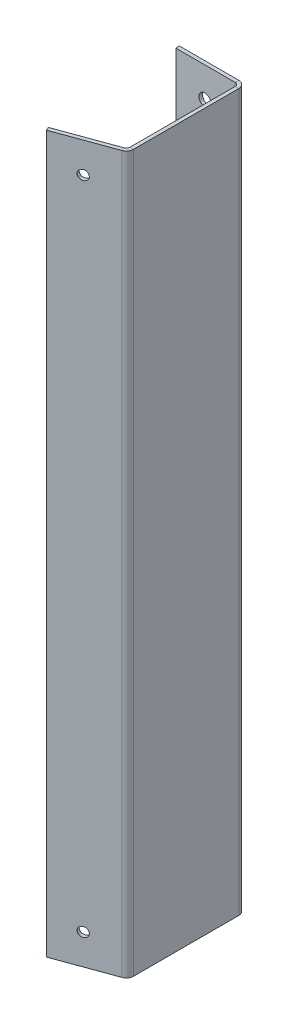
ISO-10303-21;
HEADER;
FILE_DESCRIPTION(('STEP AP214'),'2;1');
FILE_NAME('part.step','',(''),(''),'','','');
FILE_SCHEMA(('AUTOMOTIVE_DESIGN { 1 0 10303 214 1 1 1 1 }'));
ENDSEC;
DATA;
#1=APPLICATION_CONTEXT('core data for automotive mechanical design processes');
#2=APPLICATION_PROTOCOL_DEFINITION('international standard','automotive_design',2000,#1);
#3=PRODUCT_CONTEXT('',#1,'mechanical');
#4=PRODUCT('Part','Part','',(#3));
#5=PRODUCT_RELATED_PRODUCT_CATEGORY('part','',(#4));
#6=PRODUCT_DEFINITION_FORMATION('','',#4);
#7=PRODUCT_DEFINITION_CONTEXT('part definition',#1,'design');
#8=PRODUCT_DEFINITION('design','',#6,#7);
#9=PRODUCT_DEFINITION_SHAPE('','',#8);
#10=(LENGTH_UNIT() NAMED_UNIT(*) SI_UNIT(.MILLI.,.METRE.));
#11=(NAMED_UNIT(*) PLANE_ANGLE_UNIT() SI_UNIT($,.RADIAN.));
#12=(NAMED_UNIT(*) SI_UNIT($,.STERADIAN.) SOLID_ANGLE_UNIT());
#13=UNCERTAINTY_MEASURE_WITH_UNIT(LENGTH_MEASURE(1.E-05),#10,'distance_accuracy_value','');
#14=(GEOMETRIC_REPRESENTATION_CONTEXT(3) GLOBAL_UNCERTAINTY_ASSIGNED_CONTEXT((#13)) GLOBAL_UNIT_ASSIGNED_CONTEXT((#10,
#11,#12)) REPRESENTATION_CONTEXT('',''));
#15=CARTESIAN_POINT('',(0.,0.,0.));
#16=DIRECTION('',(0.,0.,1.));
#17=DIRECTION('',(1.,0.,0.));
#18=AXIS2_PLACEMENT_3D('',#15,#16,#17);
#19=CARTESIAN_POINT('',(-1.5,150.,-50.));
#20=DIRECTION('',(0.,1.,0.));
#21=DIRECTION('',(0.,0.,1.));
#22=AXIS2_PLACEMENT_3D('',#19,#20,#21);
#23=PLANE('',#22);
#24=DIRECTION('',(0.,0.,1.));
#25=VECTOR('',#24,1.);
#26=CARTESIAN_POINT('',(-1.5,150.,-50.));
#27=LINE('',#26,#25);
#28=CARTESIAN_POINT('',(-1.5,150.,-21.6));
#29=VERTEX_POINT('',#28);
#30=CARTESIAN_POINT('',(-1.5,150.,22.4993773853709));
#31=VERTEX_POINT('',#30);
#32=EDGE_CURVE('E330',#29,#31,#27,.T.);
#33=ORIENTED_EDGE('',*,*,#32,.T.);
#34=DIRECTION('',(1.,0.,0.));
#35=VECTOR('',#34,1.);
#36=CARTESIAN_POINT('',(-1.5,150.,22.4993773853709));
#37=LINE('',#36,#35);
#38=CARTESIAN_POINT('',(0.,150.,22.4993773853709));
#39=VERTEX_POINT('',#38);
#40=EDGE_CURVE('E12',#31,#39,#37,.T.);
#41=ORIENTED_EDGE('',*,*,#40,.T.);
#42=DIRECTION('',(0.,0.,1.));
#43=VECTOR('',#42,1.);
#44=CARTESIAN_POINT('',(0.,150.,-50.));
#45=LINE('',#44,#43);
#46=CARTESIAN_POINT('',(0.,150.,-21.6));
#47=VERTEX_POINT('',#46);
#48=EDGE_CURVE('E274',#47,#39,#45,.T.);
#49=ORIENTED_EDGE('',*,*,#48,.F.);
#50=DIRECTION('',(1.,0.,0.));
#51=VECTOR('',#50,1.);
#52=CARTESIAN_POINT('',(-1.5,150.,-21.6));
#53=LINE('',#52,#51);
#54=EDGE_CURVE('E279',#29,#47,#53,.T.);
#55=ORIENTED_EDGE('',*,*,#54,.F.);
#56=EDGE_LOOP('',(#33,#41,#49,#55));
#57=FACE_BOUND('',#56,.T.);
#58=ADVANCED_FACE('F102',(#57),#23,.T.);
#59=CARTESIAN_POINT('',(-1.5,-150.,-50.));
#60=DIRECTION('',(0.,-1.,0.));
#61=DIRECTION('',(0.,0.,-1.));
#62=AXIS2_PLACEMENT_3D('',#59,#60,#61);
#63=PLANE('',#62);
#64=DIRECTION('',(0.,0.,-1.));
#65=VECTOR('',#64,1.);
#66=CARTESIAN_POINT('',(0.,-150.,-50.));
#67=LINE('',#66,#65);
#68=CARTESIAN_POINT('',(0.,-150.,22.4993773853709));
#69=VERTEX_POINT('',#68);
#70=CARTESIAN_POINT('',(0.,-150.,-21.6));
#71=VERTEX_POINT('',#70);
#72=EDGE_CURVE('E273',#69,#71,#67,.T.);
#73=ORIENTED_EDGE('',*,*,#72,.F.);
#74=DIRECTION('',(-1.,0.,0.));
#75=VECTOR('',#74,1.);
#76=CARTESIAN_POINT('',(-1.5,-150.,22.4993773853709));
#77=LINE('',#76,#75);
#78=CARTESIAN_POINT('',(-1.5,-150.,22.4993773853709));
#79=VERTEX_POINT('',#78);
#80=EDGE_CURVE('E331',#69,#79,#77,.T.);
#81=ORIENTED_EDGE('',*,*,#80,.T.);
#82=DIRECTION('',(0.,0.,-1.));
#83=VECTOR('',#82,1.);
#84=CARTESIAN_POINT('',(-1.5,-150.,-50.));
#85=LINE('',#84,#83);
#86=CARTESIAN_POINT('',(-1.5,-150.,-21.6));
#87=VERTEX_POINT('',#86);
#88=EDGE_CURVE('E108',#79,#87,#85,.T.);
#89=ORIENTED_EDGE('',*,*,#88,.T.);
#90=DIRECTION('',(-1.,0.,0.));
#91=VECTOR('',#90,1.);
#92=CARTESIAN_POINT('',(-1.5,-150.,-21.6));
#93=LINE('',#92,#91);
#94=EDGE_CURVE('E276',#71,#87,#93,.T.);
#95=ORIENTED_EDGE('',*,*,#94,.F.);
#96=EDGE_LOOP('',(#73,#81,#89,#95));
#97=FACE_BOUND('',#96,.T.);
#98=ADVANCED_FACE('F358',(#97),#63,.T.);
#99=CARTESIAN_POINT('',(-1.5,0.,0.));
#100=DIRECTION('',(-1.,0.,0.));
#101=DIRECTION('',(0.,0.,1.));
#102=AXIS2_PLACEMENT_3D('',#99,#100,#101);
#103=PLANE('',#102);
#104=ORIENTED_EDGE('',*,*,#88,.F.);
#105=DIRECTION('',(0.,1.,0.));
#106=VECTOR('',#105,1.);
#107=CARTESIAN_POINT('',(-1.5,0.,22.4993773853709));
#108=LINE('',#107,#106);
#109=EDGE_CURVE('E316',#79,#31,#108,.T.);
#110=ORIENTED_EDGE('',*,*,#109,.T.);
#111=ORIENTED_EDGE('',*,*,#32,.F.);
#112=DIRECTION('',(0.,1.,0.));
#113=VECTOR('',#112,1.);
#114=CARTESIAN_POINT('',(-1.5,0.,-21.6));
#115=LINE('',#114,#113);
#116=EDGE_CURVE('E261',#87,#29,#115,.T.);
#117=ORIENTED_EDGE('',*,*,#116,.F.);
#118=EDGE_LOOP('',(#104,#110,#111,#117));
#119=FACE_BOUND('',#118,.T.);
#120=ADVANCED_FACE('F360',(#119),#103,.T.);
#121=CARTESIAN_POINT('',(-27.8657082647115,150.,-23.0999999999999));
#122=DIRECTION('',(0.,1.,0.));
#123=DIRECTION('',(1.,0.,0.));
#124=AXIS2_PLACEMENT_3D('',#121,#122,#123);
#125=PLANE('',#124);
#126=DIRECTION('',(1.,0.,0.));
#127=VECTOR('',#126,1.);
#128=CARTESIAN_POINT('',(-27.8657082647115,150.,-23.0999999999999));
#129=LINE('',#128,#127);
#130=CARTESIAN_POINT('',(-27.8657082647115,150.,-23.0999999999999));
#131=VERTEX_POINT('',#130);
#132=CARTESIAN_POINT('',(-3.00000000000001,150.,-23.1));
#133=VERTEX_POINT('',#132);
#134=EDGE_CURVE('E298',#131,#133,#129,.T.);
#135=ORIENTED_EDGE('',*,*,#134,.T.);
#136=DIRECTION('',(0.,0.,-1.));
#137=VECTOR('',#136,1.);
#138=CARTESIAN_POINT('',(-3.00000000000001,150.,-23.1));
#139=LINE('',#138,#137);
#140=CARTESIAN_POINT('',(-3.00000000000001,150.,-24.6));
#141=VERTEX_POINT('',#140);
#142=EDGE_CURVE('E314',#133,#141,#139,.T.);
#143=ORIENTED_EDGE('',*,*,#142,.T.);
#144=DIRECTION('',(1.,0.,0.));
#145=VECTOR('',#144,1.);
#146=CARTESIAN_POINT('',(-27.8657082647115,150.,-24.5999999999999));
#147=LINE('',#146,#145);
#148=CARTESIAN_POINT('',(-27.8657082647115,150.,-24.5999999999999));
#149=VERTEX_POINT('',#148);
#150=EDGE_CURVE('E322',#149,#141,#147,.T.);
#151=ORIENTED_EDGE('',*,*,#150,.F.);
#152=DIRECTION('',(0.,0.,-1.));
#153=VECTOR('',#152,1.);
#154=CARTESIAN_POINT('',(-27.8657082647115,150.,-23.0999999999999));
#155=LINE('',#154,#153);
#156=EDGE_CURVE('E296',#131,#149,#155,.T.);
#157=ORIENTED_EDGE('',*,*,#156,.F.);
#158=EDGE_LOOP('',(#135,#143,#151,#157));
#159=FACE_BOUND('',#158,.T.);
#160=ADVANCED_FACE('F375',(#159),#125,.T.);
#161=CARTESIAN_POINT('',(-27.8657082647115,-150.,-23.0999999999999));
#162=DIRECTION('',(0.,-1.,0.));
#163=DIRECTION('',(-1.,0.,0.));
#164=AXIS2_PLACEMENT_3D('',#161,#162,#163);
#165=PLANE('',#164);
#166=DIRECTION('',(-1.,0.,0.));
#167=VECTOR('',#166,1.);
#168=CARTESIAN_POINT('',(-27.8657082647115,-150.,-24.5999999999999));
#169=LINE('',#168,#167);
#170=CARTESIAN_POINT('',(-3.00000000000001,-150.,-24.6));
#171=VERTEX_POINT('',#170);
#172=CARTESIAN_POINT('',(-27.8657082647115,-150.,-24.5999999999999));
#173=VERTEX_POINT('',#172);
#174=EDGE_CURVE('E300',#171,#173,#169,.T.);
#175=ORIENTED_EDGE('',*,*,#174,.F.);
#176=DIRECTION('',(0.,0.,1.));
#177=VECTOR('',#176,1.);
#178=CARTESIAN_POINT('',(-3.00000000000001,-150.,-23.1));
#179=LINE('',#178,#177);
#180=CARTESIAN_POINT('',(-3.00000000000001,-150.,-23.1));
#181=VERTEX_POINT('',#180);
#182=EDGE_CURVE('E308',#171,#181,#179,.T.);
#183=ORIENTED_EDGE('',*,*,#182,.T.);
#184=DIRECTION('',(-1.,0.,0.));
#185=VECTOR('',#184,1.);
#186=CARTESIAN_POINT('',(-27.8657082647115,-150.,-23.0999999999999));
#187=LINE('',#186,#185);
#188=CARTESIAN_POINT('',(-27.8657082647115,-150.,-23.0999999999999));
#189=VERTEX_POINT('',#188);
#190=EDGE_CURVE('E293',#181,#189,#187,.T.);
#191=ORIENTED_EDGE('',*,*,#190,.T.);
#192=DIRECTION('',(0.,0.,-1.));
#193=VECTOR('',#192,1.);
#194=CARTESIAN_POINT('',(-27.8657082647115,-150.,-23.0999999999999));
#195=LINE('',#194,#193);
#196=EDGE_CURVE('E287',#189,#173,#195,.T.);
#197=ORIENTED_EDGE('',*,*,#196,.T.);
#198=EDGE_LOOP('',(#175,#183,#191,#197));
#199=FACE_BOUND('',#198,.T.);
#200=ADVANCED_FACE('F379',(#199),#165,.T.);
#201=CARTESIAN_POINT('',(22.1342917352885,0.,-23.1000000000001));
#202=DIRECTION('',(0.,0.,1.));
#203=DIRECTION('',(1.,0.,0.));
#204=AXIS2_PLACEMENT_3D('',#201,#202,#203);
#205=PLANE('',#204);
#206=CARTESIAN_POINT('',(-15.7,-137.3,-23.1));
#207=DIRECTION('',(0.,0.,1.));
#208=DIRECTION('',(1.,0.,0.));
#209=AXIS2_PLACEMENT_3D('',#206,#207,#208);
#210=CIRCLE('',#209,2.5);
#211=CARTESIAN_POINT('',(-13.2,-137.3,-23.1));
#212=VERTEX_POINT('',#211);
#213=EDGE_CURVE('E448',#212,#212,#210,.T.);
#214=ORIENTED_EDGE('',*,*,#213,.F.);
#215=EDGE_LOOP('',(#214));
#216=FACE_BOUND('',#215,.T.);
#217=CARTESIAN_POINT('',(-15.7,137.3,-23.1));
#218=DIRECTION('',(0.,0.,1.));
#219=DIRECTION('',(1.,0.,0.));
#220=AXIS2_PLACEMENT_3D('',#217,#218,#219);
#221=CIRCLE('',#220,2.5);
#222=CARTESIAN_POINT('',(-13.2,137.3,-23.1));
#223=VERTEX_POINT('',#222);
#224=EDGE_CURVE('E445',#223,#223,#221,.T.);
#225=ORIENTED_EDGE('',*,*,#224,.F.);
#226=EDGE_LOOP('',(#225));
#227=FACE_BOUND('',#226,.T.);
#228=CARTESIAN_POINT('',(-15.7,0.,-23.1));
#229=DIRECTION('',(0.,0.,1.));
#230=DIRECTION('',(1.,0.,0.));
#231=AXIS2_PLACEMENT_3D('',#228,#229,#230);
#232=CIRCLE('',#231,2.5);
#233=CARTESIAN_POINT('',(-13.2,0.,-23.1));
#234=VERTEX_POINT('',#233);
#235=EDGE_CURVE('E432',#234,#234,#232,.T.);
#236=ORIENTED_EDGE('',*,*,#235,.F.);
#237=EDGE_LOOP('',(#236));
#238=FACE_BOUND('',#237,.T.);
#239=ORIENTED_EDGE('',*,*,#190,.F.);
#240=DIRECTION('',(0.,1.,0.));
#241=VECTOR('',#240,1.);
#242=CARTESIAN_POINT('',(-3.00000000000001,0.,-23.1));
#243=LINE('',#242,#241);
#244=EDGE_CURVE('E301',#181,#133,#243,.T.);
#245=ORIENTED_EDGE('',*,*,#244,.T.);
#246=ORIENTED_EDGE('',*,*,#134,.F.);
#247=DIRECTION('',(0.,1.,0.));
#248=VECTOR('',#247,1.);
#249=CARTESIAN_POINT('',(-27.8657082647115,-150.,-23.0999999999999));
#250=LINE('',#249,#248);
#251=EDGE_CURVE('E289',#189,#131,#250,.T.);
#252=ORIENTED_EDGE('',*,*,#251,.F.);
#253=EDGE_LOOP('',(#239,#245,#246,#252));
#254=FACE_BOUND('',#253,.T.);
#255=ADVANCED_FACE('F367',(#216,#227,#238,#254),#205,.T.);
#256=CARTESIAN_POINT('',(-27.8657082647115,-150.,-23.0999999999999));
#257=DIRECTION('',(-1.,0.,0.));
#258=DIRECTION('',(0.,0.,1.));
#259=AXIS2_PLACEMENT_3D('',#256,#257,#258);
#260=PLANE('',#259);
#261=DIRECTION('',(0.,1.,0.));
#262=VECTOR('',#261,1.);
#263=CARTESIAN_POINT('',(-27.8657082647115,-150.,-24.5999999999999));
#264=LINE('',#263,#262);
#265=EDGE_CURVE('E292',#173,#149,#264,.T.);
#266=ORIENTED_EDGE('',*,*,#265,.F.);
#267=ORIENTED_EDGE('',*,*,#196,.F.);
#268=ORIENTED_EDGE('',*,*,#251,.T.);
#269=ORIENTED_EDGE('',*,*,#156,.T.);
#270=EDGE_LOOP('',(#266,#267,#268,#269));
#271=FACE_BOUND('',#270,.T.);
#272=ADVANCED_FACE('F376',(#271),#260,.T.);
#273=CARTESIAN_POINT('',(22.1342917352885,0.,-24.6000000000001));
#274=DIRECTION('',(0.,0.,1.));
#275=DIRECTION('',(1.,0.,0.));
#276=AXIS2_PLACEMENT_3D('',#273,#274,#275);
#277=PLANE('',#276);
#278=CARTESIAN_POINT('',(-15.7,-137.3,-24.6));
#279=DIRECTION('',(0.,0.,-1.));
#280=DIRECTION('',(-1.,0.,0.));
#281=AXIS2_PLACEMENT_3D('',#278,#279,#280);
#282=CIRCLE('',#281,2.5);
#283=CARTESIAN_POINT('',(-18.2,-137.3,-24.6));
#284=VERTEX_POINT('',#283);
#285=EDGE_CURVE('E453',#284,#284,#282,.T.);
#286=ORIENTED_EDGE('',*,*,#285,.F.);
#287=EDGE_LOOP('',(#286));
#288=FACE_BOUND('',#287,.T.);
#289=CARTESIAN_POINT('',(-15.7,137.3,-24.6));
#290=DIRECTION('',(0.,0.,-1.));
#291=DIRECTION('',(-1.,0.,0.));
#292=AXIS2_PLACEMENT_3D('',#289,#290,#291);
#293=CIRCLE('',#292,2.5);
#294=CARTESIAN_POINT('',(-18.2,137.3,-24.6));
#295=VERTEX_POINT('',#294);
#296=EDGE_CURVE('E447',#295,#295,#293,.T.);
#297=ORIENTED_EDGE('',*,*,#296,.F.);
#298=EDGE_LOOP('',(#297));
#299=FACE_BOUND('',#298,.T.);
#300=CARTESIAN_POINT('',(-15.7,0.,-24.6));
#301=DIRECTION('',(0.,0.,-1.));
#302=DIRECTION('',(-1.,0.,0.));
#303=AXIS2_PLACEMENT_3D('',#300,#301,#302);
#304=CIRCLE('',#303,2.5);
#305=CARTESIAN_POINT('',(-18.2,0.,-24.6));
#306=VERTEX_POINT('',#305);
#307=EDGE_CURVE('E438',#306,#306,#304,.T.);
#308=ORIENTED_EDGE('',*,*,#307,.F.);
#309=EDGE_LOOP('',(#308));
#310=FACE_BOUND('',#309,.T.);
#311=DIRECTION('',(0.,1.,0.));
#312=VECTOR('',#311,1.);
#313=CARTESIAN_POINT('',(-3.00000000000001,0.,-24.6));
#314=LINE('',#313,#312);
#315=EDGE_CURVE('E315',#171,#141,#314,.T.);
#316=ORIENTED_EDGE('',*,*,#315,.F.);
#317=ORIENTED_EDGE('',*,*,#174,.T.);
#318=ORIENTED_EDGE('',*,*,#265,.T.);
#319=ORIENTED_EDGE('',*,*,#150,.T.);
#320=EDGE_LOOP('',(#316,#317,#318,#319));
#321=FACE_BOUND('',#320,.T.);
#322=ADVANCED_FACE('F463',(#288,#299,#310,#321),#277,.F.);
#323=CARTESIAN_POINT('',(0.,0.,0.));
#324=DIRECTION('',(-1.,0.,0.));
#325=DIRECTION('',(0.,0.,1.));
#326=AXIS2_PLACEMENT_3D('',#323,#324,#325);
#327=PLANE('',#326);
#328=DIRECTION('',(0.,1.,0.));
#329=VECTOR('',#328,1.);
#330=CARTESIAN_POINT('',(0.,0.,22.4993773853709));
#331=LINE('',#330,#329);
#332=EDGE_CURVE('E112',#69,#39,#331,.T.);
#333=ORIENTED_EDGE('',*,*,#332,.F.);
#334=ORIENTED_EDGE('',*,*,#72,.T.);
#335=DIRECTION('',(0.,1.,0.));
#336=VECTOR('',#335,1.);
#337=CARTESIAN_POINT('',(0.,0.,-21.6));
#338=LINE('',#337,#336);
#339=EDGE_CURVE('E266',#71,#47,#338,.T.);
#340=ORIENTED_EDGE('',*,*,#339,.T.);
#341=ORIENTED_EDGE('',*,*,#48,.T.);
#342=EDGE_LOOP('',(#333,#334,#340,#341));
#343=FACE_BOUND('',#342,.T.);
#344=ADVANCED_FACE('F383',(#343),#327,.F.);
#345=CARTESIAN_POINT('',(-3.,-150.,-21.6));
#346=DIRECTION('',(0.,1.,0.));
#347=DIRECTION('',(0.,0.,1.));
#348=AXIS2_PLACEMENT_3D('',#345,#346,#347);
#349=PLANE('',#348);
#350=ORIENTED_EDGE('',*,*,#182,.F.);
#351=CARTESIAN_POINT('',(-3.,-150.,-21.6));
#352=DIRECTION('',(0.,-1.,0.));
#353=DIRECTION('',(0.,0.,-1.));
#354=AXIS2_PLACEMENT_3D('',#351,#352,#353);
#355=CIRCLE('',#354,3.);
#356=EDGE_CURVE('E249',#171,#71,#355,.T.);
#357=ORIENTED_EDGE('',*,*,#356,.T.);
#358=ORIENTED_EDGE('',*,*,#94,.T.);
#359=CARTESIAN_POINT('',(-3.,-150.,-21.6));
#360=DIRECTION('',(0.,-1.,0.));
#361=DIRECTION('',(0.,0.,1.));
#362=AXIS2_PLACEMENT_3D('',#359,#360,#361);
#363=CIRCLE('',#362,1.5);
#364=EDGE_CURVE('E256',#181,#87,#363,.T.);
#365=ORIENTED_EDGE('',*,*,#364,.F.);
#366=EDGE_LOOP('',(#350,#357,#358,#365));
#367=FACE_BOUND('',#366,.T.);
#368=ADVANCED_FACE('F361',(#367),#349,.F.);
#369=CARTESIAN_POINT('',(-3.,150.,-21.6));
#370=DIRECTION('',(0.,-1.,0.));
#371=DIRECTION('',(0.,0.,-1.));
#372=AXIS2_PLACEMENT_3D('',#369,#370,#371);
#373=PLANE('',#372);
#374=CARTESIAN_POINT('',(-3.,150.,-21.6));
#375=DIRECTION('',(0.,-1.,0.));
#376=DIRECTION('',(0.,0.,-1.));
#377=AXIS2_PLACEMENT_3D('',#374,#375,#376);
#378=CIRCLE('',#377,3.);
#379=EDGE_CURVE('E259',#47,#141,#378,.F.);
#380=ORIENTED_EDGE('',*,*,#379,.T.);
#381=ORIENTED_EDGE('',*,*,#142,.F.);
#382=CARTESIAN_POINT('',(-3.,150.,-21.6));
#383=DIRECTION('',(0.,1.,0.));
#384=DIRECTION('',(0.,0.,-1.));
#385=AXIS2_PLACEMENT_3D('',#382,#383,#384);
#386=CIRCLE('',#385,1.5);
#387=EDGE_CURVE('E128',#29,#133,#386,.T.);
#388=ORIENTED_EDGE('',*,*,#387,.F.);
#389=ORIENTED_EDGE('',*,*,#54,.T.);
#390=EDGE_LOOP('',(#380,#381,#388,#389));
#391=FACE_BOUND('',#390,.T.);
#392=ADVANCED_FACE('F390',(#391),#373,.F.);
#393=CARTESIAN_POINT('',(-3.,300.024567690831,-21.6));
#394=DIRECTION('',(0.,-1.,0.));
#395=DIRECTION('',(0.,0.,-1.));
#396=AXIS2_PLACEMENT_3D('',#393,#394,#395);
#397=CYLINDRICAL_SURFACE('',#396,1.5);
#398=ORIENTED_EDGE('',*,*,#116,.T.);
#399=ORIENTED_EDGE('',*,*,#387,.T.);
#400=ORIENTED_EDGE('',*,*,#244,.F.);
#401=ORIENTED_EDGE('',*,*,#364,.T.);
#402=EDGE_LOOP('',(#398,#399,#400,#401));
#403=FACE_BOUND('',#402,.T.);
#404=ADVANCED_FACE('F366',(#403),#397,.F.);
#405=CARTESIAN_POINT('',(-3.,300.024567690831,-21.6));
#406=DIRECTION('',(0.,-1.,0.));
#407=DIRECTION('',(0.,0.,-1.));
#408=AXIS2_PLACEMENT_3D('',#405,#406,#407);
#409=CYLINDRICAL_SURFACE('',#408,3.);
#410=ORIENTED_EDGE('',*,*,#339,.F.);
#411=ORIENTED_EDGE('',*,*,#356,.F.);
#412=ORIENTED_EDGE('',*,*,#315,.T.);
#413=ORIENTED_EDGE('',*,*,#379,.F.);
#414=EDGE_LOOP('',(#410,#411,#412,#413));
#415=FACE_BOUND('',#414,.T.);
#416=ADVANCED_FACE('F384',(#415),#409,.T.);
#417=CARTESIAN_POINT('',(-3.,-150.,22.4993773853709));
#418=DIRECTION('',(0.,1.,0.));
#419=DIRECTION('',(0.,0.,1.));
#420=AXIS2_PLACEMENT_3D('',#417,#418,#419);
#421=PLANE('',#420);
#422=ORIENTED_EDGE('',*,*,#80,.F.);
#423=CARTESIAN_POINT('',(-3.,-150.,22.4993773853709));
#424=DIRECTION('',(0.,1.,0.));
#425=DIRECTION('',(0.,0.,1.));
#426=AXIS2_PLACEMENT_3D('',#423,#424,#425);
#427=CIRCLE('',#426,3.);
#428=CARTESIAN_POINT('',(-1.97393957002301,-150.,25.3184552477286));
#429=VERTEX_POINT('',#428);
#430=EDGE_CURVE('E219',#69,#429,#427,.F.);
#431=ORIENTED_EDGE('',*,*,#430,.T.);
#432=DIRECTION('',(-0.342020143325666,0.,-0.93969262078591));
#433=VECTOR('',#432,1.);
#434=CARTESIAN_POINT('',(-2.48696978501151,-150.,23.9089163165497));
#435=LINE('',#434,#433);
#436=CARTESIAN_POINT('',(-2.48696978501151,-150.,23.9089163165497));
#437=VERTEX_POINT('',#436);
#438=EDGE_CURVE('E222',#429,#437,#435,.T.);
#439=ORIENTED_EDGE('',*,*,#438,.T.);
#440=CARTESIAN_POINT('',(-3.,-150.,22.4993773853709));
#441=DIRECTION('',(0.,-1.,0.));
#442=DIRECTION('',(0.,0.,1.));
#443=AXIS2_PLACEMENT_3D('',#440,#441,#442);
#444=CIRCLE('',#443,1.5);
#445=EDGE_CURVE('E241',#79,#437,#444,.T.);
#446=ORIENTED_EDGE('',*,*,#445,.F.);
#447=EDGE_LOOP('',(#422,#431,#439,#446));
#448=FACE_BOUND('',#447,.T.);
#449=ADVANCED_FACE('F401',(#448),#421,.F.);
#450=CARTESIAN_POINT('',(-3.,150.,22.4993773853709));
#451=DIRECTION('',(0.,-1.,0.));
#452=DIRECTION('',(0.,0.,-1.));
#453=AXIS2_PLACEMENT_3D('',#450,#451,#452);
#454=PLANE('',#453);
#455=DIRECTION('',(0.342020143325666,0.,0.93969262078591));
#456=VECTOR('',#455,1.);
#457=CARTESIAN_POINT('',(-2.4869697850115,150.,23.9089163165497));
#458=LINE('',#457,#456);
#459=CARTESIAN_POINT('',(-2.4869697850115,150.,23.9089163165497));
#460=VERTEX_POINT('',#459);
#461=CARTESIAN_POINT('',(-1.973939570023,150.,25.3184552477286));
#462=VERTEX_POINT('',#461);
#463=EDGE_CURVE('E204',#460,#462,#458,.T.);
#464=ORIENTED_EDGE('',*,*,#463,.T.);
#465=CARTESIAN_POINT('',(-3.,150.,22.4993773853709));
#466=DIRECTION('',(0.,1.,0.));
#467=DIRECTION('',(0.,0.,1.));
#468=AXIS2_PLACEMENT_3D('',#465,#466,#467);
#469=CIRCLE('',#468,3.);
#470=EDGE_CURVE('E246',#462,#39,#469,.T.);
#471=ORIENTED_EDGE('',*,*,#470,.T.);
#472=ORIENTED_EDGE('',*,*,#40,.F.);
#473=CARTESIAN_POINT('',(-3.,150.,22.4993773853709));
#474=DIRECTION('',(0.,1.,0.));
#475=DIRECTION('',(0.,0.,-1.));
#476=AXIS2_PLACEMENT_3D('',#473,#474,#475);
#477=CIRCLE('',#476,1.5);
#478=EDGE_CURVE('E244',#460,#31,#477,.T.);
#479=ORIENTED_EDGE('',*,*,#478,.F.);
#480=EDGE_LOOP('',(#464,#471,#472,#479));
#481=FACE_BOUND('',#480,.T.);
#482=ADVANCED_FACE('F393',(#481),#454,.F.);
#483=CARTESIAN_POINT('',(-3.,-300.016343581262,22.4993773853709));
#484=DIRECTION('',(0.,1.,0.));
#485=DIRECTION('',(0.,0.,1.));
#486=AXIS2_PLACEMENT_3D('',#483,#484,#485);
#487=CYLINDRICAL_SURFACE('',#486,1.5);
#488=ORIENTED_EDGE('',*,*,#478,.T.);
#489=ORIENTED_EDGE('',*,*,#109,.F.);
#490=ORIENTED_EDGE('',*,*,#445,.T.);
#491=DIRECTION('',(0.,1.,0.));
#492=VECTOR('',#491,1.);
#493=CARTESIAN_POINT('',(-2.4869697850115,0.,23.9089163165497));
#494=LINE('',#493,#492);
#495=EDGE_CURVE('E240',#437,#460,#494,.T.);
#496=ORIENTED_EDGE('',*,*,#495,.T.);
#497=EDGE_LOOP('',(#488,#489,#490,#496));
#498=FACE_BOUND('',#497,.T.);
#499=ADVANCED_FACE('F392',(#498),#487,.F.);
#500=CARTESIAN_POINT('',(-3.,-300.016343581262,22.4993773853709));
#501=DIRECTION('',(0.,1.,0.));
#502=DIRECTION('',(0.,0.,1.));
#503=AXIS2_PLACEMENT_3D('',#500,#501,#502);
#504=CYLINDRICAL_SURFACE('',#503,3.);
#505=ORIENTED_EDGE('',*,*,#470,.F.);
#506=DIRECTION('',(0.,1.,0.));
#507=VECTOR('',#506,1.);
#508=CARTESIAN_POINT('',(-1.973939570023,0.,25.3184552477286));
#509=LINE('',#508,#507);
#510=EDGE_CURVE('E406',#429,#462,#509,.T.);
#511=ORIENTED_EDGE('',*,*,#510,.F.);
#512=ORIENTED_EDGE('',*,*,#430,.F.);
#513=ORIENTED_EDGE('',*,*,#332,.T.);
#514=EDGE_LOOP('',(#505,#511,#512,#513));
#515=FACE_BOUND('',#514,.T.);
#516=ADVANCED_FACE('F404',(#515),#504,.T.);
#517=CARTESIAN_POINT('',(-25.7459869181647,-150.,32.3745062313051));
#518=DIRECTION('',(-0.93969262078591,0.,0.342020143325666));
#519=DIRECTION('',(0.342020143325666,0.,0.93969262078591));
#520=AXIS2_PLACEMENT_3D('',#517,#518,#519);
#521=PLANE('',#520);
#522=DIRECTION('',(0.,-1.,0.));
#523=VECTOR('',#522,1.);
#524=CARTESIAN_POINT('',(-25.2329567031762,-150.,33.7840451624839));
#525=LINE('',#524,#523);
#526=CARTESIAN_POINT('',(-25.2329567031762,150.,33.7840451624839));
#527=VERTEX_POINT('',#526);
#528=CARTESIAN_POINT('',(-25.2329567031762,-150.,33.7840451624839));
#529=VERTEX_POINT('',#528);
#530=EDGE_CURVE('E209',#527,#529,#525,.T.);
#531=ORIENTED_EDGE('',*,*,#530,.F.);
#532=DIRECTION('',(0.342020143325666,0.,0.93969262078591));
#533=VECTOR('',#532,1.);
#534=CARTESIAN_POINT('',(-25.7459869181647,150.,32.3745062313051));
#535=LINE('',#534,#533);
#536=CARTESIAN_POINT('',(-25.7459869181647,150.,32.3745062313051));
#537=VERTEX_POINT('',#536);
#538=EDGE_CURVE('E202',#537,#527,#535,.T.);
#539=ORIENTED_EDGE('',*,*,#538,.F.);
#540=DIRECTION('',(0.,-1.,0.));
#541=VECTOR('',#540,1.);
#542=CARTESIAN_POINT('',(-25.7459869181647,-150.,32.3745062313051));
#543=LINE('',#542,#541);
#544=CARTESIAN_POINT('',(-25.7459869181647,-150.,32.3745062313051));
#545=VERTEX_POINT('',#544);
#546=EDGE_CURVE('E213',#537,#545,#543,.T.);
#547=ORIENTED_EDGE('',*,*,#546,.T.);
#548=DIRECTION('',(0.342020143325666,0.,0.93969262078591));
#549=VECTOR('',#548,1.);
#550=CARTESIAN_POINT('',(-25.7459869181647,-150.,32.3745062313051));
#551=LINE('',#550,#549);
#552=EDGE_CURVE('E223',#545,#529,#551,.T.);
#553=ORIENTED_EDGE('',*,*,#552,.T.);
#554=EDGE_LOOP('',(#531,#539,#547,#553));
#555=FACE_BOUND('',#554,.T.);
#556=ADVANCED_FACE('F212',(#555),#521,.T.);
#557=CARTESIAN_POINT('',(21.2386441211307,0.,15.2734990650218));
#558=DIRECTION('',(-0.342020143325666,0.,-0.93969262078591));
#559=DIRECTION('',(-0.93969262078591,0.,0.342020143325666));
#560=AXIS2_PLACEMENT_3D('',#557,#558,#559);
#561=PLANE('',#560);
#562=CARTESIAN_POINT('',(-14.4210660689926,137.3,28.2525721367857));
#563=DIRECTION('',(-0.342020143325666,0.,-0.93969262078591));
#564=DIRECTION('',(-0.939692620785909,0.,0.342020143325666));
#565=AXIS2_PLACEMENT_3D('',#562,#563,#564);
#566=CIRCLE('',#565,2.);
#567=CARTESIAN_POINT('',(-16.3004513105644,137.3,28.936612423437));
#568=VERTEX_POINT('',#567);
#569=EDGE_CURVE('E428',#568,#568,#566,.T.);
#570=ORIENTED_EDGE('',*,*,#569,.F.);
#571=EDGE_LOOP('',(#570));
#572=FACE_BOUND('',#571,.T.);
#573=CARTESIAN_POINT('',(-14.4210660689926,-137.3,28.2525721367857));
#574=DIRECTION('',(-0.342020143325666,0.,-0.93969262078591));
#575=DIRECTION('',(-0.939692620785909,0.,0.342020143325666));
#576=AXIS2_PLACEMENT_3D('',#573,#574,#575);
#577=CIRCLE('',#576,2.);
#578=CARTESIAN_POINT('',(-16.3004513105644,-137.3,28.936612423437));
#579=VERTEX_POINT('',#578);
#580=EDGE_CURVE('E239',#579,#579,#577,.T.);
#581=ORIENTED_EDGE('',*,*,#580,.F.);
#582=EDGE_LOOP('',(#581));
#583=FACE_BOUND('',#582,.T.);
#584=ORIENTED_EDGE('',*,*,#495,.F.);
#585=DIRECTION('',(0.93969262078591,0.,-0.342020143325666));
#586=VECTOR('',#585,1.);
#587=CARTESIAN_POINT('',(68.2232751604262,-150.,-1.82750810126155));
#588=LINE('',#587,#586);
#589=EDGE_CURVE('E221',#545,#437,#588,.T.);
#590=ORIENTED_EDGE('',*,*,#589,.F.);
#591=ORIENTED_EDGE('',*,*,#546,.F.);
#592=DIRECTION('',(-0.93969262078591,0.,0.342020143325666));
#593=VECTOR('',#592,1.);
#594=CARTESIAN_POINT('',(68.2232751604262,150.,-1.82750810126156));
#595=LINE('',#594,#593);
#596=EDGE_CURVE('E196',#460,#537,#595,.T.);
#597=ORIENTED_EDGE('',*,*,#596,.F.);
#598=EDGE_LOOP('',(#584,#590,#591,#597));
#599=FACE_BOUND('',#598,.T.);
#600=ADVANCED_FACE('F218',(#572,#583,#599),#561,.T.);
#601=CARTESIAN_POINT('',(68.2232751604262,-150.,-1.82750810126155));
#602=DIRECTION('',(0.,-1.,0.));
#603=DIRECTION('',(0.93969262078591,0.,-0.342020143325666));
#604=AXIS2_PLACEMENT_3D('',#601,#602,#603);
#605=PLANE('',#604);
#606=ORIENTED_EDGE('',*,*,#438,.F.);
#607=DIRECTION('',(0.93969262078591,0.,-0.342020143325666));
#608=VECTOR('',#607,1.);
#609=CARTESIAN_POINT('',(68.7363053754147,-150.,-0.417969170082688));
#610=LINE('',#609,#608);
#611=EDGE_CURVE('E402',#529,#429,#610,.T.);
#612=ORIENTED_EDGE('',*,*,#611,.F.);
#613=ORIENTED_EDGE('',*,*,#552,.F.);
#614=ORIENTED_EDGE('',*,*,#589,.T.);
#615=EDGE_LOOP('',(#606,#612,#613,#614));
#616=FACE_BOUND('',#615,.T.);
#617=ADVANCED_FACE('F400',(#616),#605,.T.);
#618=CARTESIAN_POINT('',(21.7516743361192,0.,16.6830379962006));
#619=DIRECTION('',(-0.342020143325666,0.,-0.93969262078591));
#620=DIRECTION('',(-0.93969262078591,0.,0.342020143325666));
#621=AXIS2_PLACEMENT_3D('',#618,#619,#620);
#622=PLANE('',#621);
#623=CARTESIAN_POINT('',(-13.9080358540041,137.3,29.6621110679646));
#624=DIRECTION('',(0.342020143325666,0.,0.939692620785909));
#625=DIRECTION('',(0.939692620785909,0.,-0.342020143325666));
#626=AXIS2_PLACEMENT_3D('',#623,#624,#625);
#627=CIRCLE('',#626,2.);
#628=CARTESIAN_POINT('',(-12.0286506124322,137.3,28.9780707813132));
#629=VERTEX_POINT('',#628);
#630=EDGE_CURVE('E427',#629,#629,#627,.T.);
#631=ORIENTED_EDGE('',*,*,#630,.F.);
#632=EDGE_LOOP('',(#631));
#633=FACE_BOUND('',#632,.T.);
#634=CARTESIAN_POINT('',(-13.9080358540041,-137.3,29.6621110679646));
#635=DIRECTION('',(0.342020143325666,0.,0.939692620785909));
#636=DIRECTION('',(0.939692620785909,0.,-0.342020143325666));
#637=AXIS2_PLACEMENT_3D('',#634,#635,#636);
#638=CIRCLE('',#637,2.);
#639=CARTESIAN_POINT('',(-12.0286506124322,-137.3,28.9780707813132));
#640=VERTEX_POINT('',#639);
#641=EDGE_CURVE('E422',#640,#640,#638,.T.);
#642=ORIENTED_EDGE('',*,*,#641,.F.);
#643=EDGE_LOOP('',(#642));
#644=FACE_BOUND('',#643,.T.);
#645=ORIENTED_EDGE('',*,*,#611,.T.);
#646=ORIENTED_EDGE('',*,*,#510,.T.);
#647=DIRECTION('',(-0.93969262078591,0.,0.342020143325666));
#648=VECTOR('',#647,1.);
#649=CARTESIAN_POINT('',(68.7363053754147,150.,-0.417969170082695));
#650=LINE('',#649,#648);
#651=EDGE_CURVE('E408',#462,#527,#650,.T.);
#652=ORIENTED_EDGE('',*,*,#651,.T.);
#653=ORIENTED_EDGE('',*,*,#530,.T.);
#654=EDGE_LOOP('',(#645,#646,#652,#653));
#655=FACE_BOUND('',#654,.T.);
#656=ADVANCED_FACE('F530',(#633,#644,#655),#622,.F.);
#657=CARTESIAN_POINT('',(68.2232751604262,150.,-1.82750810126156));
#658=DIRECTION('',(0.,1.,0.));
#659=DIRECTION('',(-0.93969262078591,0.,0.342020143325666));
#660=AXIS2_PLACEMENT_3D('',#657,#658,#659);
#661=PLANE('',#660);
#662=ORIENTED_EDGE('',*,*,#463,.F.);
#663=ORIENTED_EDGE('',*,*,#596,.T.);
#664=ORIENTED_EDGE('',*,*,#538,.T.);
#665=ORIENTED_EDGE('',*,*,#651,.F.);
#666=EDGE_LOOP('',(#662,#663,#664,#665));
#667=FACE_BOUND('',#666,.T.);
#668=ADVANCED_FACE('F199',(#667),#661,.T.);
#669=CARTESIAN_POINT('',(-13.9080358540041,-137.3,29.6621110679646));
#670=DIRECTION('',(0.342020143325666,0.,0.939692620785909));
#671=DIRECTION('',(0.939692620785909,0.,-0.342020143325666));
#672=AXIS2_PLACEMENT_3D('',#669,#670,#671);
#673=CYLINDRICAL_SURFACE('',#672,2.);
#674=ORIENTED_EDGE('',*,*,#641,.T.);
#675=EDGE_LOOP('',(#674));
#676=FACE_BOUND('',#675,.T.);
#677=ORIENTED_EDGE('',*,*,#580,.T.);
#678=EDGE_LOOP('',(#677));
#679=FACE_BOUND('',#678,.T.);
#680=ADVANCED_FACE('F527',(#676,#679),#673,.F.);
#681=CARTESIAN_POINT('',(-13.9080358540041,137.3,29.6621110679646));
#682=DIRECTION('',(0.342020143325666,0.,0.939692620785909));
#683=DIRECTION('',(0.939692620785909,0.,-0.342020143325666));
#684=AXIS2_PLACEMENT_3D('',#681,#682,#683);
#685=CYLINDRICAL_SURFACE('',#684,2.);
#686=ORIENTED_EDGE('',*,*,#630,.T.);
#687=EDGE_LOOP('',(#686));
#688=FACE_BOUND('',#687,.T.);
#689=ORIENTED_EDGE('',*,*,#569,.T.);
#690=EDGE_LOOP('',(#689));
#691=FACE_BOUND('',#690,.T.);
#692=ADVANCED_FACE('F477',(#688,#691),#685,.F.);
#693=CARTESIAN_POINT('',(-15.7,0.,-24.6));
#694=DIRECTION('',(0.,0.,-1.));
#695=DIRECTION('',(-1.,0.,0.));
#696=AXIS2_PLACEMENT_3D('',#693,#694,#695);
#697=CYLINDRICAL_SURFACE('',#696,2.5);
#698=ORIENTED_EDGE('',*,*,#307,.T.);
#699=EDGE_LOOP('',(#698));
#700=FACE_BOUND('',#699,.T.);
#701=ORIENTED_EDGE('',*,*,#235,.T.);
#702=EDGE_LOOP('',(#701));
#703=FACE_BOUND('',#702,.T.);
#704=ADVANCED_FACE('F475',(#700,#703),#697,.F.);
#705=CARTESIAN_POINT('',(-15.7,137.3,-24.6));
#706=DIRECTION('',(0.,0.,-1.));
#707=DIRECTION('',(-1.,0.,0.));
#708=AXIS2_PLACEMENT_3D('',#705,#706,#707);
#709=CYLINDRICAL_SURFACE('',#708,2.5);
#710=ORIENTED_EDGE('',*,*,#296,.T.);
#711=EDGE_LOOP('',(#710));
#712=FACE_BOUND('',#711,.T.);
#713=ORIENTED_EDGE('',*,*,#224,.T.);
#714=EDGE_LOOP('',(#713));
#715=FACE_BOUND('',#714,.T.);
#716=ADVANCED_FACE('F474',(#712,#715),#709,.F.);
#717=CARTESIAN_POINT('',(-15.7,-137.3,-24.6));
#718=DIRECTION('',(0.,0.,-1.));
#719=DIRECTION('',(-1.,0.,0.));
#720=AXIS2_PLACEMENT_3D('',#717,#718,#719);
#721=CYLINDRICAL_SURFACE('',#720,2.5);
#722=ORIENTED_EDGE('',*,*,#285,.T.);
#723=EDGE_LOOP('',(#722));
#724=FACE_BOUND('',#723,.T.);
#725=ORIENTED_EDGE('',*,*,#213,.T.);
#726=EDGE_LOOP('',(#725));
#727=FACE_BOUND('',#726,.T.);
#728=ADVANCED_FACE('F459',(#724,#727),#721,.F.);
#729=CLOSED_SHELL('',(#58,#98,#120,#160,#200,#255,#272,#322,#344,#368,#392,#404,#416,#449,#482,
#499,#516,#556,#600,#617,#656,#668,#680,#692,#704,#716,#728));
#730=MANIFOLD_SOLID_BREP('B2',#729);
#731=ADVANCED_BREP_SHAPE_REPRESENTATION('',(#18,#730),#14);
#732=SHAPE_DEFINITION_REPRESENTATION(#9,#731);
ENDSEC;
END-ISO-10303-21;
